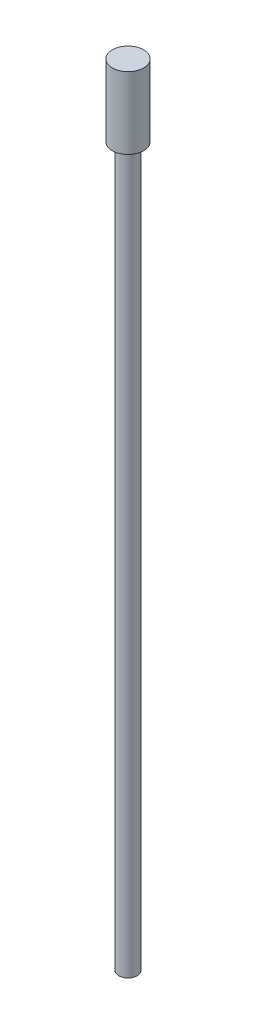
ISO-10303-21;
HEADER;
FILE_DESCRIPTION(('STEP AP214'),'2;1');
FILE_NAME('part.step','',(''),(''),'','','');
FILE_SCHEMA(('AUTOMOTIVE_DESIGN { 1 0 10303 214 1 1 1 1 }'));
ENDSEC;
DATA;
#1=APPLICATION_CONTEXT('core data for automotive mechanical design processes');
#2=APPLICATION_PROTOCOL_DEFINITION('international standard','automotive_design',2000,#1);
#3=PRODUCT_CONTEXT('',#1,'mechanical');
#4=PRODUCT('Part','Part','',(#3));
#5=PRODUCT_RELATED_PRODUCT_CATEGORY('part','',(#4));
#6=PRODUCT_DEFINITION_FORMATION('','',#4);
#7=PRODUCT_DEFINITION_CONTEXT('part definition',#1,'design');
#8=PRODUCT_DEFINITION('design','',#6,#7);
#9=PRODUCT_DEFINITION_SHAPE('','',#8);
#10=(LENGTH_UNIT() NAMED_UNIT(*) SI_UNIT(.MILLI.,.METRE.));
#11=(NAMED_UNIT(*) PLANE_ANGLE_UNIT() SI_UNIT($,.RADIAN.));
#12=(NAMED_UNIT(*) SI_UNIT($,.STERADIAN.) SOLID_ANGLE_UNIT());
#13=UNCERTAINTY_MEASURE_WITH_UNIT(LENGTH_MEASURE(1.E-05),#10,'distance_accuracy_value','');
#14=(GEOMETRIC_REPRESENTATION_CONTEXT(3) GLOBAL_UNCERTAINTY_ASSIGNED_CONTEXT((#13)) GLOBAL_UNIT_ASSIGNED_CONTEXT((#10,
#11,#12)) REPRESENTATION_CONTEXT('',''));
#15=CARTESIAN_POINT('',(0.,0.,0.));
#16=DIRECTION('',(0.,0.,1.));
#17=DIRECTION('',(1.,0.,0.));
#18=AXIS2_PLACEMENT_3D('',#15,#16,#17);
#19=CARTESIAN_POINT('',(0.,200.,0.));
#20=DIRECTION('',(0.,-1.,0.));
#21=DIRECTION('',(0.,0.,-1.));
#22=AXIS2_PLACEMENT_3D('',#19,#20,#21);
#23=CYLINDRICAL_SURFACE('',#22,2.55);
#24=CARTESIAN_POINT('',(0.,200.,0.));
#25=DIRECTION('',(0.,1.,0.));
#26=DIRECTION('',(0.,0.,1.));
#27=AXIS2_PLACEMENT_3D('',#24,#25,#26);
#28=CIRCLE('',#27,2.55);
#29=CARTESIAN_POINT('',(0.,200.,2.55));
#30=VERTEX_POINT('',#29);
#31=EDGE_CURVE('E10',#30,#30,#28,.T.);
#32=ORIENTED_EDGE('',*,*,#31,.F.);
#33=EDGE_LOOP('',(#32));
#34=FACE_BOUND('',#33,.T.);
#35=CARTESIAN_POINT('',(0.,0.,0.));
#36=DIRECTION('',(0.,1.,0.));
#37=DIRECTION('',(0.,0.,1.));
#38=AXIS2_PLACEMENT_3D('',#35,#36,#37);
#39=CIRCLE('',#38,2.55);
#40=CARTESIAN_POINT('',(0.,0.,2.55));
#41=VERTEX_POINT('',#40);
#42=EDGE_CURVE('E37',#41,#41,#39,.T.);
#43=ORIENTED_EDGE('',*,*,#42,.T.);
#44=EDGE_LOOP('',(#43));
#45=FACE_BOUND('',#44,.T.);
#46=ADVANCED_FACE('F34',(#34,#45),#23,.T.);
#47=CARTESIAN_POINT('',(0.,0.,0.));
#48=DIRECTION('',(0.,1.,0.));
#49=DIRECTION('',(0.,0.,1.));
#50=AXIS2_PLACEMENT_3D('',#47,#48,#49);
#51=PLANE('',#50);
#52=ORIENTED_EDGE('',*,*,#42,.F.);
#53=EDGE_LOOP('',(#52));
#54=FACE_BOUND('',#53,.T.);
#55=ADVANCED_FACE('F57',(#54),#51,.F.);
#56=CARTESIAN_POINT('',(0.,220.,0.));
#57=DIRECTION('',(0.,-1.,0.));
#58=DIRECTION('',(0.,0.,-1.));
#59=AXIS2_PLACEMENT_3D('',#56,#57,#58);
#60=CYLINDRICAL_SURFACE('',#59,4.375);
#61=CARTESIAN_POINT('',(0.,220.,0.));
#62=DIRECTION('',(0.,1.,0.));
#63=DIRECTION('',(0.,0.,1.));
#64=AXIS2_PLACEMENT_3D('',#61,#62,#63);
#65=CIRCLE('',#64,4.375);
#66=CARTESIAN_POINT('',(0.,220.,4.375));
#67=VERTEX_POINT('',#66);
#68=EDGE_CURVE('E44',#67,#67,#65,.T.);
#69=ORIENTED_EDGE('',*,*,#68,.F.);
#70=EDGE_LOOP('',(#69));
#71=FACE_BOUND('',#70,.T.);
#72=CARTESIAN_POINT('',(0.,200.,0.));
#73=DIRECTION('',(0.,1.,0.));
#74=DIRECTION('',(0.,0.,1.));
#75=AXIS2_PLACEMENT_3D('',#72,#73,#74);
#76=CIRCLE('',#75,4.375);
#77=CARTESIAN_POINT('',(0.,200.,4.375));
#78=VERTEX_POINT('',#77);
#79=EDGE_CURVE('E46',#78,#78,#76,.T.);
#80=ORIENTED_EDGE('',*,*,#79,.T.);
#81=EDGE_LOOP('',(#80));
#82=FACE_BOUND('',#81,.T.);
#83=ADVANCED_FACE('F54',(#71,#82),#60,.T.);
#84=CARTESIAN_POINT('',(0.,220.,0.));
#85=DIRECTION('',(0.,1.,0.));
#86=DIRECTION('',(0.,0.,1.));
#87=AXIS2_PLACEMENT_3D('',#84,#85,#86);
#88=PLANE('',#87);
#89=ORIENTED_EDGE('',*,*,#68,.T.);
#90=EDGE_LOOP('',(#89));
#91=FACE_BOUND('',#90,.T.);
#92=ADVANCED_FACE('F52',(#91),#88,.T.);
#93=CARTESIAN_POINT('',(0.,200.,0.));
#94=DIRECTION('',(0.,1.,0.));
#95=DIRECTION('',(0.,0.,1.));
#96=AXIS2_PLACEMENT_3D('',#93,#94,#95);
#97=PLANE('',#96);
#98=ORIENTED_EDGE('',*,*,#31,.T.);
#99=EDGE_LOOP('',(#98));
#100=FACE_BOUND('',#99,.T.);
#101=ORIENTED_EDGE('',*,*,#79,.F.);
#102=EDGE_LOOP('',(#101));
#103=FACE_BOUND('',#102,.T.);
#104=ADVANCED_FACE('F61',(#100,#103),#97,.F.);
#105=CLOSED_SHELL('',(#46,#55,#83,#92,#104));
#106=MANIFOLD_SOLID_BREP('B2',#105);
#107=ADVANCED_BREP_SHAPE_REPRESENTATION('',(#18,#106),#14);
#108=SHAPE_DEFINITION_REPRESENTATION(#9,#107);
ENDSEC;
END-ISO-10303-21;
